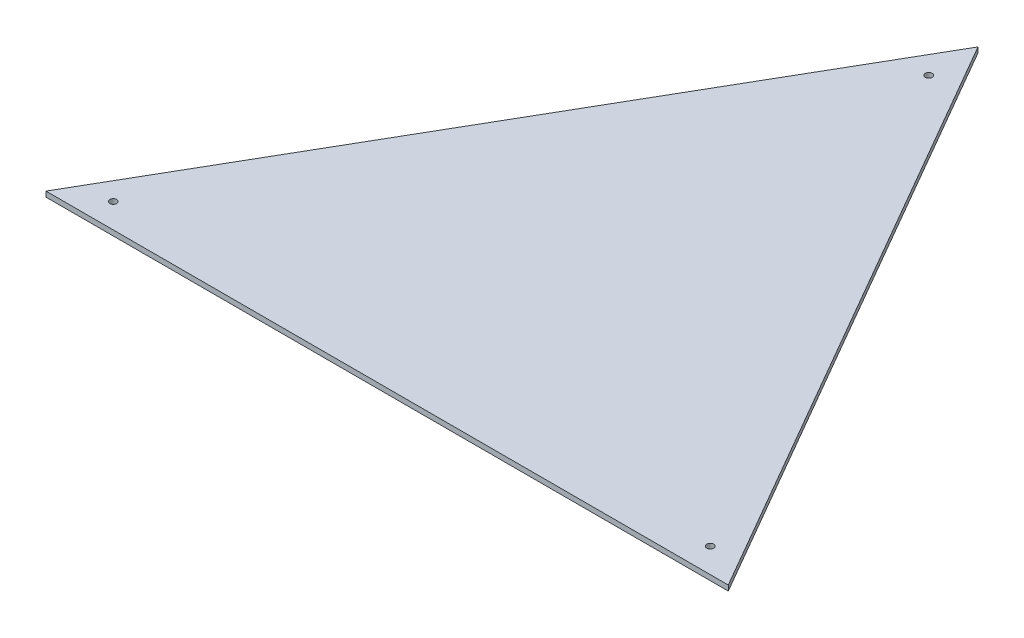
ISO-10303-21;
HEADER;
FILE_DESCRIPTION(('STEP AP214'),'2;1');
FILE_NAME('part.step','',(''),(''),'','','');
FILE_SCHEMA(('AUTOMOTIVE_DESIGN { 1 0 10303 214 1 1 1 1 }'));
ENDSEC;
DATA;
#1=APPLICATION_CONTEXT('core data for automotive mechanical design processes');
#2=APPLICATION_PROTOCOL_DEFINITION('international standard','automotive_design',2000,#1);
#3=PRODUCT_CONTEXT('',#1,'mechanical');
#4=PRODUCT('Part','Part','',(#3));
#5=PRODUCT_RELATED_PRODUCT_CATEGORY('part','',(#4));
#6=PRODUCT_DEFINITION_FORMATION('','',#4);
#7=PRODUCT_DEFINITION_CONTEXT('part definition',#1,'design');
#8=PRODUCT_DEFINITION('design','',#6,#7);
#9=PRODUCT_DEFINITION_SHAPE('','',#8);
#10=(LENGTH_UNIT() NAMED_UNIT(*) SI_UNIT(.MILLI.,.METRE.));
#11=(NAMED_UNIT(*) PLANE_ANGLE_UNIT() SI_UNIT($,.RADIAN.));
#12=(NAMED_UNIT(*) SI_UNIT($,.STERADIAN.) SOLID_ANGLE_UNIT());
#13=UNCERTAINTY_MEASURE_WITH_UNIT(LENGTH_MEASURE(1.E-05),#10,'distance_accuracy_value','');
#14=(GEOMETRIC_REPRESENTATION_CONTEXT(3) GLOBAL_UNCERTAINTY_ASSIGNED_CONTEXT((#13)) GLOBAL_UNIT_ASSIGNED_CONTEXT((#10,
#11,#12)) REPRESENTATION_CONTEXT('',''));
#15=CARTESIAN_POINT('',(0.,0.,0.));
#16=DIRECTION('',(0.,0.,1.));
#17=DIRECTION('',(1.,0.,0.));
#18=AXIS2_PLACEMENT_3D('',#15,#16,#17);
#19=CARTESIAN_POINT('',(307.958633585747,4.7625,177.8));
#20=DIRECTION('',(-0.866025403784438,0.,0.5));
#21=DIRECTION('',(0.5,0.,0.866025403784438));
#22=AXIS2_PLACEMENT_3D('',#19,#20,#21);
#23=PLANE('',#22);
#24=DIRECTION('',(-0.5,0.,-0.866025403784438));
#25=VECTOR('',#24,1.);
#26=CARTESIAN_POINT('',(307.958633585747,0.,177.8));
#27=LINE('',#26,#25);
#28=CARTESIAN_POINT('',(307.958633585747,0.,177.8));
#29=VERTEX_POINT('',#28);
#30=CARTESIAN_POINT('',(-1.11074344166784E-13,0.,-355.6));
#31=VERTEX_POINT('',#30);
#32=EDGE_CURVE('E89',#29,#31,#27,.T.);
#33=ORIENTED_EDGE('',*,*,#32,.T.);
#34=DIRECTION('',(0.,-1.,0.));
#35=VECTOR('',#34,1.);
#36=CARTESIAN_POINT('',(-1.11074344166784E-13,4.7625,-355.6));
#37=LINE('',#36,#35);
#38=CARTESIAN_POINT('',(-1.11074344166784E-13,4.7625,-355.6));
#39=VERTEX_POINT('',#38);
#40=EDGE_CURVE('E11',#39,#31,#37,.T.);
#41=ORIENTED_EDGE('',*,*,#40,.F.);
#42=DIRECTION('',(-0.5,0.,-0.866025403784438));
#43=VECTOR('',#42,1.);
#44=CARTESIAN_POINT('',(307.958633585747,4.7625,177.8));
#45=LINE('',#44,#43);
#46=CARTESIAN_POINT('',(307.958633585747,4.7625,177.8));
#47=VERTEX_POINT('',#46);
#48=EDGE_CURVE('E81',#47,#39,#45,.T.);
#49=ORIENTED_EDGE('',*,*,#48,.F.);
#50=DIRECTION('',(0.,-1.,0.));
#51=VECTOR('',#50,1.);
#52=CARTESIAN_POINT('',(307.958633585747,4.7625,177.8));
#53=LINE('',#52,#51);
#54=EDGE_CURVE('E90',#47,#29,#53,.T.);
#55=ORIENTED_EDGE('',*,*,#54,.T.);
#56=EDGE_LOOP('',(#33,#41,#49,#55));
#57=FACE_BOUND('',#56,.T.);
#58=ADVANCED_FACE('F39',(#57),#23,.F.);
#59=CARTESIAN_POINT('',(-1.11074344166784E-13,4.7625,-355.6));
#60=DIRECTION('',(0.866025403784439,0.,0.5));
#61=DIRECTION('',(0.5,0.,-0.866025403784439));
#62=AXIS2_PLACEMENT_3D('',#59,#60,#61);
#63=PLANE('',#62);
#64=DIRECTION('',(-0.5,0.,0.866025403784439));
#65=VECTOR('',#64,1.);
#66=CARTESIAN_POINT('',(-1.11074344166784E-13,0.,-355.6));
#67=LINE('',#66,#65);
#68=CARTESIAN_POINT('',(-307.958633585746,0.,177.8));
#69=VERTEX_POINT('',#68);
#70=EDGE_CURVE('E68',#31,#69,#67,.T.);
#71=ORIENTED_EDGE('',*,*,#70,.T.);
#72=DIRECTION('',(0.,-1.,0.));
#73=VECTOR('',#72,1.);
#74=CARTESIAN_POINT('',(-307.958633585746,4.7625,177.8));
#75=LINE('',#74,#73);
#76=CARTESIAN_POINT('',(-307.958633585746,4.7625,177.8));
#77=VERTEX_POINT('',#76);
#78=EDGE_CURVE('E48',#77,#69,#75,.T.);
#79=ORIENTED_EDGE('',*,*,#78,.F.);
#80=DIRECTION('',(-0.5,0.,0.866025403784439));
#81=VECTOR('',#80,1.);
#82=CARTESIAN_POINT('',(-1.11074344166784E-13,4.7625,-355.6));
#83=LINE('',#82,#81);
#84=EDGE_CURVE('E76',#39,#77,#83,.T.);
#85=ORIENTED_EDGE('',*,*,#84,.F.);
#86=ORIENTED_EDGE('',*,*,#40,.T.);
#87=EDGE_LOOP('',(#71,#79,#85,#86));
#88=FACE_BOUND('',#87,.T.);
#89=ADVANCED_FACE('F77',(#88),#63,.F.);
#90=CARTESIAN_POINT('',(-307.958633585746,4.7625,177.8));
#91=DIRECTION('',(0.,0.,-1.));
#92=DIRECTION('',(-1.,0.,0.));
#93=AXIS2_PLACEMENT_3D('',#90,#91,#92);
#94=PLANE('',#93);
#95=DIRECTION('',(1.,0.,0.));
#96=VECTOR('',#95,1.);
#97=CARTESIAN_POINT('',(-307.958633585746,0.,177.8));
#98=LINE('',#97,#96);
#99=EDGE_CURVE('E73',#69,#29,#98,.T.);
#100=ORIENTED_EDGE('',*,*,#99,.T.);
#101=ORIENTED_EDGE('',*,*,#54,.F.);
#102=DIRECTION('',(1.,0.,0.));
#103=VECTOR('',#102,1.);
#104=CARTESIAN_POINT('',(-307.958633585746,4.7625,177.8));
#105=LINE('',#104,#103);
#106=EDGE_CURVE('E56',#77,#47,#105,.T.);
#107=ORIENTED_EDGE('',*,*,#106,.F.);
#108=ORIENTED_EDGE('',*,*,#78,.T.);
#109=EDGE_LOOP('',(#100,#101,#107,#108));
#110=FACE_BOUND('',#109,.T.);
#111=ADVANCED_FACE('F107',(#110),#94,.F.);
#112=CARTESIAN_POINT('',(0.,4.7625,0.));
#113=DIRECTION('',(0.,1.,0.));
#114=DIRECTION('',(0.,0.,1.));
#115=AXIS2_PLACEMENT_3D('',#112,#113,#114);
#116=PLANE('',#115);
#117=CARTESIAN_POINT('',(0.,4.7625,-311.15));
#118=DIRECTION('',(0.,1.,0.));
#119=DIRECTION('',(0.,0.,1.));
#120=AXIS2_PLACEMENT_3D('',#117,#118,#119);
#121=CIRCLE('',#120,3.175);
#122=CARTESIAN_POINT('',(0.,4.7625,-307.975));
#123=VERTEX_POINT('',#122);
#124=EDGE_CURVE('E99',#123,#123,#121,.T.);
#125=ORIENTED_EDGE('',*,*,#124,.F.);
#126=EDGE_LOOP('',(#125));
#127=FACE_BOUND('',#126,.T.);
#128=CARTESIAN_POINT('',(-269.463804387528,4.7625,155.575));
#129=DIRECTION('',(0.,1.,0.));
#130=DIRECTION('',(0.,0.,1.));
#131=AXIS2_PLACEMENT_3D('',#128,#129,#130);
#132=CIRCLE('',#131,3.17499999999997);
#133=CARTESIAN_POINT('',(-269.463804387528,4.7625,158.75));
#134=VERTEX_POINT('',#133);
#135=EDGE_CURVE('E179',#134,#134,#132,.T.);
#136=ORIENTED_EDGE('',*,*,#135,.F.);
#137=EDGE_LOOP('',(#136));
#138=FACE_BOUND('',#137,.T.);
#139=CARTESIAN_POINT('',(269.463804387528,4.7625,155.575));
#140=DIRECTION('',(0.,1.,0.));
#141=DIRECTION('',(0.,0.,1.));
#142=AXIS2_PLACEMENT_3D('',#139,#140,#141);
#143=CIRCLE('',#142,3.17499999999997);
#144=CARTESIAN_POINT('',(269.463804387528,4.7625,158.75));
#145=VERTEX_POINT('',#144);
#146=EDGE_CURVE('E189',#145,#145,#143,.T.);
#147=ORIENTED_EDGE('',*,*,#146,.F.);
#148=EDGE_LOOP('',(#147));
#149=FACE_BOUND('',#148,.T.);
#150=ORIENTED_EDGE('',*,*,#48,.T.);
#151=ORIENTED_EDGE('',*,*,#84,.T.);
#152=ORIENTED_EDGE('',*,*,#106,.T.);
#153=EDGE_LOOP('',(#150,#151,#152));
#154=FACE_BOUND('',#153,.T.);
#155=ADVANCED_FACE('F84',(#127,#138,#149,#154),#116,.T.);
#156=CARTESIAN_POINT('',(0.,0.,0.));
#157=DIRECTION('',(0.,1.,0.));
#158=DIRECTION('',(0.,0.,1.));
#159=AXIS2_PLACEMENT_3D('',#156,#157,#158);
#160=PLANE('',#159);
#161=CARTESIAN_POINT('',(0.,0.,-311.15));
#162=DIRECTION('',(0.,1.,0.));
#163=DIRECTION('',(0.,0.,1.));
#164=AXIS2_PLACEMENT_3D('',#161,#162,#163);
#165=CIRCLE('',#164,3.175);
#166=CARTESIAN_POINT('',(0.,0.,-307.975));
#167=VERTEX_POINT('',#166);
#168=EDGE_CURVE('E93',#167,#167,#165,.T.);
#169=ORIENTED_EDGE('',*,*,#168,.T.);
#170=EDGE_LOOP('',(#169));
#171=FACE_BOUND('',#170,.T.);
#172=CARTESIAN_POINT('',(-269.463804387528,0.,155.575));
#173=DIRECTION('',(0.,1.,0.));
#174=DIRECTION('',(0.,0.,1.));
#175=AXIS2_PLACEMENT_3D('',#172,#173,#174);
#176=CIRCLE('',#175,3.17499999999997);
#177=CARTESIAN_POINT('',(-269.463804387528,0.,158.75));
#178=VERTEX_POINT('',#177);
#179=EDGE_CURVE('E175',#178,#178,#176,.T.);
#180=ORIENTED_EDGE('',*,*,#179,.T.);
#181=EDGE_LOOP('',(#180));
#182=FACE_BOUND('',#181,.T.);
#183=CARTESIAN_POINT('',(269.463804387528,0.,155.575));
#184=DIRECTION('',(0.,1.,0.));
#185=DIRECTION('',(0.,0.,1.));
#186=AXIS2_PLACEMENT_3D('',#183,#184,#185);
#187=CIRCLE('',#186,3.17499999999997);
#188=CARTESIAN_POINT('',(269.463804387528,0.,158.75));
#189=VERTEX_POINT('',#188);
#190=EDGE_CURVE('E185',#189,#189,#187,.T.);
#191=ORIENTED_EDGE('',*,*,#190,.T.);
#192=EDGE_LOOP('',(#191));
#193=FACE_BOUND('',#192,.T.);
#194=ORIENTED_EDGE('',*,*,#32,.F.);
#195=ORIENTED_EDGE('',*,*,#99,.F.);
#196=ORIENTED_EDGE('',*,*,#70,.F.);
#197=EDGE_LOOP('',(#194,#195,#196));
#198=FACE_BOUND('',#197,.T.);
#199=ADVANCED_FACE('F108',(#171,#182,#193,#198),#160,.F.);
#200=CARTESIAN_POINT('',(269.463804387528,0.,155.575));
#201=DIRECTION('',(0.,1.,0.));
#202=DIRECTION('',(0.,0.,1.));
#203=AXIS2_PLACEMENT_3D('',#200,#201,#202);
#204=CYLINDRICAL_SURFACE('',#203,3.17499999999997);
#205=CARTESIAN_POINT('',(269.463804387528,0.,158.75));
#206=CARTESIAN_POINT('',(269.463804387528,0.049609375,158.75));
#207=CARTESIAN_POINT('',(269.463804387528,0.09921875,158.75));
#208=CARTESIAN_POINT('',(269.463804387528,0.1984375,158.75));
#209=CARTESIAN_POINT('',(269.463804387528,0.248046875,158.75));
#210=CARTESIAN_POINT('',(269.463804387528,0.347265625,158.75));
#211=CARTESIAN_POINT('',(269.463804387528,0.396875,158.75));
#212=CARTESIAN_POINT('',(269.463804387528,0.49609375,158.75));
#213=CARTESIAN_POINT('',(269.463804387528,0.545703125,158.75));
#214=CARTESIAN_POINT('',(269.463804387528,0.644921875,158.75));
#215=CARTESIAN_POINT('',(269.463804387528,0.69453125,158.75));
#216=CARTESIAN_POINT('',(269.463804387528,0.79375,158.75));
#217=CARTESIAN_POINT('',(269.463804387528,0.843359375,158.75));
#218=CARTESIAN_POINT('',(269.463804387528,0.942578125,158.75));
#219=CARTESIAN_POINT('',(269.463804387528,0.9921875,158.75));
#220=CARTESIAN_POINT('',(269.463804387528,1.09140625,158.75));
#221=CARTESIAN_POINT('',(269.463804387528,1.141015625,158.75));
#222=CARTESIAN_POINT('',(269.463804387528,1.240234375,158.75));
#223=CARTESIAN_POINT('',(269.463804387528,1.28984375,158.75));
#224=CARTESIAN_POINT('',(269.463804387528,1.3890625,158.75));
#225=CARTESIAN_POINT('',(269.463804387528,1.438671875,158.75));
#226=CARTESIAN_POINT('',(269.463804387528,1.537890625,158.75));
#227=CARTESIAN_POINT('',(269.463804387528,1.5875,158.75));
#228=CARTESIAN_POINT('',(269.463804387528,1.68671875,158.75));
#229=CARTESIAN_POINT('',(269.463804387528,1.736328125,158.75));
#230=CARTESIAN_POINT('',(269.463804387528,1.835546875,158.75));
#231=CARTESIAN_POINT('',(269.463804387528,1.88515625,158.75));
#232=CARTESIAN_POINT('',(269.463804387528,1.984375,158.75));
#233=CARTESIAN_POINT('',(269.463804387528,2.033984375,158.75));
#234=CARTESIAN_POINT('',(269.463804387528,2.133203125,158.75));
#235=CARTESIAN_POINT('',(269.463804387528,2.1828125,158.75));
#236=CARTESIAN_POINT('',(269.463804387528,2.28203125,158.75));
#237=CARTESIAN_POINT('',(269.463804387528,2.331640625,158.75));
#238=CARTESIAN_POINT('',(269.463804387528,2.430859375,158.75));
#239=CARTESIAN_POINT('',(269.463804387528,2.48046875,158.75));
#240=CARTESIAN_POINT('',(269.463804387528,2.5796875,158.75));
#241=CARTESIAN_POINT('',(269.463804387528,2.629296875,158.75));
#242=CARTESIAN_POINT('',(269.463804387528,2.728515625,158.75));
#243=CARTESIAN_POINT('',(269.463804387528,2.778125,158.75));
#244=CARTESIAN_POINT('',(269.463804387528,2.87734375,158.75));
#245=CARTESIAN_POINT('',(269.463804387528,2.926953125,158.75));
#246=CARTESIAN_POINT('',(269.463804387528,3.026171875,158.75));
#247=CARTESIAN_POINT('',(269.463804387528,3.07578125,158.75));
#248=CARTESIAN_POINT('',(269.463804387528,3.175,158.75));
#249=CARTESIAN_POINT('',(269.463804387528,3.224609375,158.75));
#250=CARTESIAN_POINT('',(269.463804387528,3.323828125,158.75));
#251=CARTESIAN_POINT('',(269.463804387528,3.3734375,158.75));
#252=CARTESIAN_POINT('',(269.463804387528,3.47265625,158.75));
#253=CARTESIAN_POINT('',(269.463804387528,3.522265625,158.75));
#254=CARTESIAN_POINT('',(269.463804387528,3.621484375,158.75));
#255=CARTESIAN_POINT('',(269.463804387528,3.67109375,158.75));
#256=CARTESIAN_POINT('',(269.463804387528,3.7703125,158.75));
#257=CARTESIAN_POINT('',(269.463804387528,3.819921875,158.75));
#258=CARTESIAN_POINT('',(269.463804387528,3.919140625,158.75));
#259=CARTESIAN_POINT('',(269.463804387528,3.96875,158.75));
#260=CARTESIAN_POINT('',(269.463804387528,4.06796875,158.75));
#261=CARTESIAN_POINT('',(269.463804387528,4.117578125,158.75));
#262=CARTESIAN_POINT('',(269.463804387528,4.216796875,158.75));
#263=CARTESIAN_POINT('',(269.463804387528,4.26640625,158.75));
#264=CARTESIAN_POINT('',(269.463804387528,4.365625,158.75));
#265=CARTESIAN_POINT('',(269.463804387528,4.415234375,158.75));
#266=CARTESIAN_POINT('',(269.463804387528,4.514453125,158.75));
#267=CARTESIAN_POINT('',(269.463804387528,4.5640625,158.75));
#268=CARTESIAN_POINT('',(269.463804387528,4.66328125,158.75));
#269=CARTESIAN_POINT('',(269.463804387528,4.712890625,158.75));
#270=CARTESIAN_POINT('',(269.463804387528,4.7625,158.75));
#271=B_SPLINE_CURVE_WITH_KNOTS('',3,(#205,#206,#207,#208,#209,#210,#211,#212,#213,#214,#215,
#216,#217,#218,#219,#220,#221,#222,#223,#224,#225,#226,#227,#228,#229,#230,#231,#232,#233,#234,
#235,#236,#237,#238,#239,#240,#241,#242,#243,#244,#245,#246,#247,#248,#249,#250,#251,#252,#253,
#254,#255,#256,#257,#258,#259,#260,#261,#262,#263,#264,#265,#266,#267,#268,#269,#270),
.UNSPECIFIED.,.F.,.F.,(4,2,2,2,2,2,2,2,2,2,2,2,2,2,2,2,2,2,2,2,2,2,2,2,2,2,2,2,2,2,2,2,4),(0.,
0.148828125,0.29765625,0.446484375,0.5953125,0.744140625,0.89296875,1.041796875,1.190625,
1.339453125,1.48828125,1.637109375,1.7859375,1.934765625,2.08359375,2.232421875,2.38125,
2.530078125,2.67890625,2.827734375,2.9765625,3.125390625,3.27421875,3.423046875,3.571875,
3.720703125,3.86953125,4.018359375,4.1671875,4.316015625,4.46484375,4.613671875,4.7625),.UNSPECIFIED.);
#272=EDGE_CURVE('BSEAM110',#189,#145,#271,.T.);
#273=ORIENTED_EDGE('',*,*,#190,.F.);
#274=ORIENTED_EDGE('',*,*,#146,.T.);
#275=ORIENTED_EDGE('',*,*,#272,.T.);
#276=ORIENTED_EDGE('',*,*,#272,.F.);
#277=EDGE_LOOP('',(#273,#275,#274,#276));
#278=FACE_BOUND('',#277,.T.);
#279=ADVANCED_FACE('F110',(#278),#204,.F.);
#280=CARTESIAN_POINT('',(-269.463804387528,0.,155.575));
#281=DIRECTION('',(0.,1.,0.));
#282=DIRECTION('',(0.,0.,1.));
#283=AXIS2_PLACEMENT_3D('',#280,#281,#282);
#284=CYLINDRICAL_SURFACE('',#283,3.17499999999997);
#285=CARTESIAN_POINT('',(-269.463804387528,0.,158.75));
#286=CARTESIAN_POINT('',(-269.463804387528,0.049609375,158.75));
#287=CARTESIAN_POINT('',(-269.463804387528,0.09921875,158.75));
#288=CARTESIAN_POINT('',(-269.463804387528,0.1984375,158.75));
#289=CARTESIAN_POINT('',(-269.463804387528,0.248046875,158.75));
#290=CARTESIAN_POINT('',(-269.463804387528,0.347265625,158.75));
#291=CARTESIAN_POINT('',(-269.463804387528,0.396875,158.75));
#292=CARTESIAN_POINT('',(-269.463804387528,0.49609375,158.75));
#293=CARTESIAN_POINT('',(-269.463804387528,0.545703125,158.75));
#294=CARTESIAN_POINT('',(-269.463804387528,0.644921875,158.75));
#295=CARTESIAN_POINT('',(-269.463804387528,0.69453125,158.75));
#296=CARTESIAN_POINT('',(-269.463804387528,0.79375,158.75));
#297=CARTESIAN_POINT('',(-269.463804387528,0.843359375,158.75));
#298=CARTESIAN_POINT('',(-269.463804387528,0.942578125,158.75));
#299=CARTESIAN_POINT('',(-269.463804387528,0.9921875,158.75));
#300=CARTESIAN_POINT('',(-269.463804387528,1.09140625,158.75));
#301=CARTESIAN_POINT('',(-269.463804387528,1.141015625,158.75));
#302=CARTESIAN_POINT('',(-269.463804387528,1.240234375,158.75));
#303=CARTESIAN_POINT('',(-269.463804387528,1.28984375,158.75));
#304=CARTESIAN_POINT('',(-269.463804387528,1.3890625,158.75));
#305=CARTESIAN_POINT('',(-269.463804387528,1.438671875,158.75));
#306=CARTESIAN_POINT('',(-269.463804387528,1.537890625,158.75));
#307=CARTESIAN_POINT('',(-269.463804387528,1.5875,158.75));
#308=CARTESIAN_POINT('',(-269.463804387528,1.68671875,158.75));
#309=CARTESIAN_POINT('',(-269.463804387528,1.736328125,158.75));
#310=CARTESIAN_POINT('',(-269.463804387528,1.835546875,158.75));
#311=CARTESIAN_POINT('',(-269.463804387528,1.88515625,158.75));
#312=CARTESIAN_POINT('',(-269.463804387528,1.984375,158.75));
#313=CARTESIAN_POINT('',(-269.463804387528,2.033984375,158.75));
#314=CARTESIAN_POINT('',(-269.463804387528,2.133203125,158.75));
#315=CARTESIAN_POINT('',(-269.463804387528,2.1828125,158.75));
#316=CARTESIAN_POINT('',(-269.463804387528,2.28203125,158.75));
#317=CARTESIAN_POINT('',(-269.463804387528,2.331640625,158.75));
#318=CARTESIAN_POINT('',(-269.463804387528,2.430859375,158.75));
#319=CARTESIAN_POINT('',(-269.463804387528,2.48046875,158.75));
#320=CARTESIAN_POINT('',(-269.463804387528,2.5796875,158.75));
#321=CARTESIAN_POINT('',(-269.463804387528,2.629296875,158.75));
#322=CARTESIAN_POINT('',(-269.463804387528,2.728515625,158.75));
#323=CARTESIAN_POINT('',(-269.463804387528,2.778125,158.75));
#324=CARTESIAN_POINT('',(-269.463804387528,2.87734375,158.75));
#325=CARTESIAN_POINT('',(-269.463804387528,2.926953125,158.75));
#326=CARTESIAN_POINT('',(-269.463804387528,3.026171875,158.75));
#327=CARTESIAN_POINT('',(-269.463804387528,3.07578125,158.75));
#328=CARTESIAN_POINT('',(-269.463804387528,3.175,158.75));
#329=CARTESIAN_POINT('',(-269.463804387528,3.224609375,158.75));
#330=CARTESIAN_POINT('',(-269.463804387528,3.323828125,158.75));
#331=CARTESIAN_POINT('',(-269.463804387528,3.3734375,158.75));
#332=CARTESIAN_POINT('',(-269.463804387528,3.47265625,158.75));
#333=CARTESIAN_POINT('',(-269.463804387528,3.522265625,158.75));
#334=CARTESIAN_POINT('',(-269.463804387528,3.621484375,158.75));
#335=CARTESIAN_POINT('',(-269.463804387528,3.67109375,158.75));
#336=CARTESIAN_POINT('',(-269.463804387528,3.7703125,158.75));
#337=CARTESIAN_POINT('',(-269.463804387528,3.819921875,158.75));
#338=CARTESIAN_POINT('',(-269.463804387528,3.919140625,158.75));
#339=CARTESIAN_POINT('',(-269.463804387528,3.96875,158.75));
#340=CARTESIAN_POINT('',(-269.463804387528,4.06796875,158.75));
#341=CARTESIAN_POINT('',(-269.463804387528,4.117578125,158.75));
#342=CARTESIAN_POINT('',(-269.463804387528,4.216796875,158.75));
#343=CARTESIAN_POINT('',(-269.463804387528,4.26640625,158.75));
#344=CARTESIAN_POINT('',(-269.463804387528,4.365625,158.75));
#345=CARTESIAN_POINT('',(-269.463804387528,4.415234375,158.75));
#346=CARTESIAN_POINT('',(-269.463804387528,4.514453125,158.75));
#347=CARTESIAN_POINT('',(-269.463804387528,4.5640625,158.75));
#348=CARTESIAN_POINT('',(-269.463804387528,4.66328125,158.75));
#349=CARTESIAN_POINT('',(-269.463804387528,4.712890625,158.75));
#350=CARTESIAN_POINT('',(-269.463804387528,4.7625,158.75));
#351=B_SPLINE_CURVE_WITH_KNOTS('',3,(#285,#286,#287,#288,#289,#290,#291,#292,#293,#294,#295,
#296,#297,#298,#299,#300,#301,#302,#303,#304,#305,#306,#307,#308,#309,#310,#311,#312,#313,#314,
#315,#316,#317,#318,#319,#320,#321,#322,#323,#324,#325,#326,#327,#328,#329,#330,#331,#332,#333,
#334,#335,#336,#337,#338,#339,#340,#341,#342,#343,#344,#345,#346,#347,#348,#349,#350),
.UNSPECIFIED.,.F.,.F.,(4,2,2,2,2,2,2,2,2,2,2,2,2,2,2,2,2,2,2,2,2,2,2,2,2,2,2,2,2,2,2,2,4),(0.,
0.148828125,0.29765625,0.446484375,0.5953125,0.744140625,0.89296875,1.041796875,1.190625,
1.339453125,1.48828125,1.637109375,1.7859375,1.934765625,2.08359375,2.232421875,2.38125,
2.530078125,2.67890625,2.827734375,2.9765625,3.125390625,3.27421875,3.423046875,3.571875,
3.720703125,3.86953125,4.018359375,4.1671875,4.316015625,4.46484375,4.613671875,4.7625),.UNSPECIFIED.);
#352=EDGE_CURVE('BSEAM117',#178,#134,#351,.T.);
#353=ORIENTED_EDGE('',*,*,#179,.F.);
#354=ORIENTED_EDGE('',*,*,#135,.T.);
#355=ORIENTED_EDGE('',*,*,#352,.T.);
#356=ORIENTED_EDGE('',*,*,#352,.F.);
#357=EDGE_LOOP('',(#353,#355,#354,#356));
#358=FACE_BOUND('',#357,.T.);
#359=ADVANCED_FACE('F117',(#358),#284,.F.);
#360=CARTESIAN_POINT('',(0.,0.,-311.15));
#361=DIRECTION('',(0.,1.,0.));
#362=DIRECTION('',(0.,0.,1.));
#363=AXIS2_PLACEMENT_3D('',#360,#361,#362);
#364=CYLINDRICAL_SURFACE('',#363,3.175);
#365=CARTESIAN_POINT('',(0.,0.,-307.975));
#366=CARTESIAN_POINT('',(0.,0.049609375,-307.975));
#367=CARTESIAN_POINT('',(0.,0.09921875,-307.975));
#368=CARTESIAN_POINT('',(0.,0.1984375,-307.975));
#369=CARTESIAN_POINT('',(0.,0.248046875,-307.975));
#370=CARTESIAN_POINT('',(0.,0.347265625,-307.975));
#371=CARTESIAN_POINT('',(0.,0.396875,-307.975));
#372=CARTESIAN_POINT('',(0.,0.49609375,-307.975));
#373=CARTESIAN_POINT('',(0.,0.545703125,-307.975));
#374=CARTESIAN_POINT('',(0.,0.644921875,-307.975));
#375=CARTESIAN_POINT('',(0.,0.69453125,-307.975));
#376=CARTESIAN_POINT('',(0.,0.79375,-307.975));
#377=CARTESIAN_POINT('',(0.,0.843359375,-307.975));
#378=CARTESIAN_POINT('',(0.,0.942578125,-307.975));
#379=CARTESIAN_POINT('',(0.,0.9921875,-307.975));
#380=CARTESIAN_POINT('',(0.,1.09140625,-307.975));
#381=CARTESIAN_POINT('',(0.,1.141015625,-307.975));
#382=CARTESIAN_POINT('',(0.,1.240234375,-307.975));
#383=CARTESIAN_POINT('',(0.,1.28984375,-307.975));
#384=CARTESIAN_POINT('',(0.,1.3890625,-307.975));
#385=CARTESIAN_POINT('',(0.,1.438671875,-307.975));
#386=CARTESIAN_POINT('',(0.,1.537890625,-307.975));
#387=CARTESIAN_POINT('',(0.,1.5875,-307.975));
#388=CARTESIAN_POINT('',(0.,1.68671875,-307.975));
#389=CARTESIAN_POINT('',(0.,1.736328125,-307.975));
#390=CARTESIAN_POINT('',(0.,1.835546875,-307.975));
#391=CARTESIAN_POINT('',(0.,1.88515625,-307.975));
#392=CARTESIAN_POINT('',(0.,1.984375,-307.975));
#393=CARTESIAN_POINT('',(0.,2.033984375,-307.975));
#394=CARTESIAN_POINT('',(0.,2.133203125,-307.975));
#395=CARTESIAN_POINT('',(0.,2.1828125,-307.975));
#396=CARTESIAN_POINT('',(0.,2.28203125,-307.975));
#397=CARTESIAN_POINT('',(0.,2.331640625,-307.975));
#398=CARTESIAN_POINT('',(0.,2.430859375,-307.975));
#399=CARTESIAN_POINT('',(0.,2.48046875,-307.975));
#400=CARTESIAN_POINT('',(0.,2.5796875,-307.975));
#401=CARTESIAN_POINT('',(0.,2.629296875,-307.975));
#402=CARTESIAN_POINT('',(0.,2.728515625,-307.975));
#403=CARTESIAN_POINT('',(0.,2.778125,-307.975));
#404=CARTESIAN_POINT('',(0.,2.87734375,-307.975));
#405=CARTESIAN_POINT('',(0.,2.926953125,-307.975));
#406=CARTESIAN_POINT('',(0.,3.026171875,-307.975));
#407=CARTESIAN_POINT('',(0.,3.07578125,-307.975));
#408=CARTESIAN_POINT('',(0.,3.175,-307.975));
#409=CARTESIAN_POINT('',(0.,3.224609375,-307.975));
#410=CARTESIAN_POINT('',(0.,3.323828125,-307.975));
#411=CARTESIAN_POINT('',(0.,3.3734375,-307.975));
#412=CARTESIAN_POINT('',(0.,3.47265625,-307.975));
#413=CARTESIAN_POINT('',(0.,3.522265625,-307.975));
#414=CARTESIAN_POINT('',(0.,3.621484375,-307.975));
#415=CARTESIAN_POINT('',(0.,3.67109375,-307.975));
#416=CARTESIAN_POINT('',(0.,3.7703125,-307.975));
#417=CARTESIAN_POINT('',(0.,3.819921875,-307.975));
#418=CARTESIAN_POINT('',(0.,3.919140625,-307.975));
#419=CARTESIAN_POINT('',(0.,3.96875,-307.975));
#420=CARTESIAN_POINT('',(0.,4.06796875,-307.975));
#421=CARTESIAN_POINT('',(0.,4.117578125,-307.975));
#422=CARTESIAN_POINT('',(0.,4.216796875,-307.975));
#423=CARTESIAN_POINT('',(0.,4.26640625,-307.975));
#424=CARTESIAN_POINT('',(0.,4.365625,-307.975));
#425=CARTESIAN_POINT('',(0.,4.415234375,-307.975));
#426=CARTESIAN_POINT('',(0.,4.514453125,-307.975));
#427=CARTESIAN_POINT('',(0.,4.5640625,-307.975));
#428=CARTESIAN_POINT('',(0.,4.66328125,-307.975));
#429=CARTESIAN_POINT('',(0.,4.712890625,-307.975));
#430=CARTESIAN_POINT('',(0.,4.7625,-307.975));
#431=B_SPLINE_CURVE_WITH_KNOTS('',3,(#365,#366,#367,#368,#369,#370,#371,#372,#373,#374,#375,
#376,#377,#378,#379,#380,#381,#382,#383,#384,#385,#386,#387,#388,#389,#390,#391,#392,#393,#394,
#395,#396,#397,#398,#399,#400,#401,#402,#403,#404,#405,#406,#407,#408,#409,#410,#411,#412,#413,
#414,#415,#416,#417,#418,#419,#420,#421,#422,#423,#424,#425,#426,#427,#428,#429,#430),
.UNSPECIFIED.,.F.,.F.,(4,2,2,2,2,2,2,2,2,2,2,2,2,2,2,2,2,2,2,2,2,2,2,2,2,2,2,2,2,2,2,2,4),(0.,
0.148828125,0.29765625,0.446484375,0.5953125,0.744140625,0.89296875,1.041796875,1.190625,
1.339453125,1.48828125,1.637109375,1.7859375,1.934765625,2.08359375,2.232421875,2.38125,
2.530078125,2.67890625,2.827734375,2.9765625,3.125390625,3.27421875,3.423046875,3.571875,
3.720703125,3.86953125,4.018359375,4.1671875,4.316015625,4.46484375,4.613671875,4.7625),.UNSPECIFIED.);
#432=EDGE_CURVE('BSEAM156',#167,#123,#431,.T.);
#433=ORIENTED_EDGE('',*,*,#168,.F.);
#434=ORIENTED_EDGE('',*,*,#124,.T.);
#435=ORIENTED_EDGE('',*,*,#432,.T.);
#436=ORIENTED_EDGE('',*,*,#432,.F.);
#437=EDGE_LOOP('',(#433,#435,#434,#436));
#438=FACE_BOUND('',#437,.T.);
#439=ADVANCED_FACE('F156',(#438),#364,.F.);
#440=CLOSED_SHELL('',(#58,#89,#111,#155,#199,#279,#359,#439));
#441=MANIFOLD_SOLID_BREP('B2',#440);
#442=ADVANCED_BREP_SHAPE_REPRESENTATION('',(#18,#441),#14);
#443=SHAPE_DEFINITION_REPRESENTATION(#9,#442);
ENDSEC;
END-ISO-10303-21;
